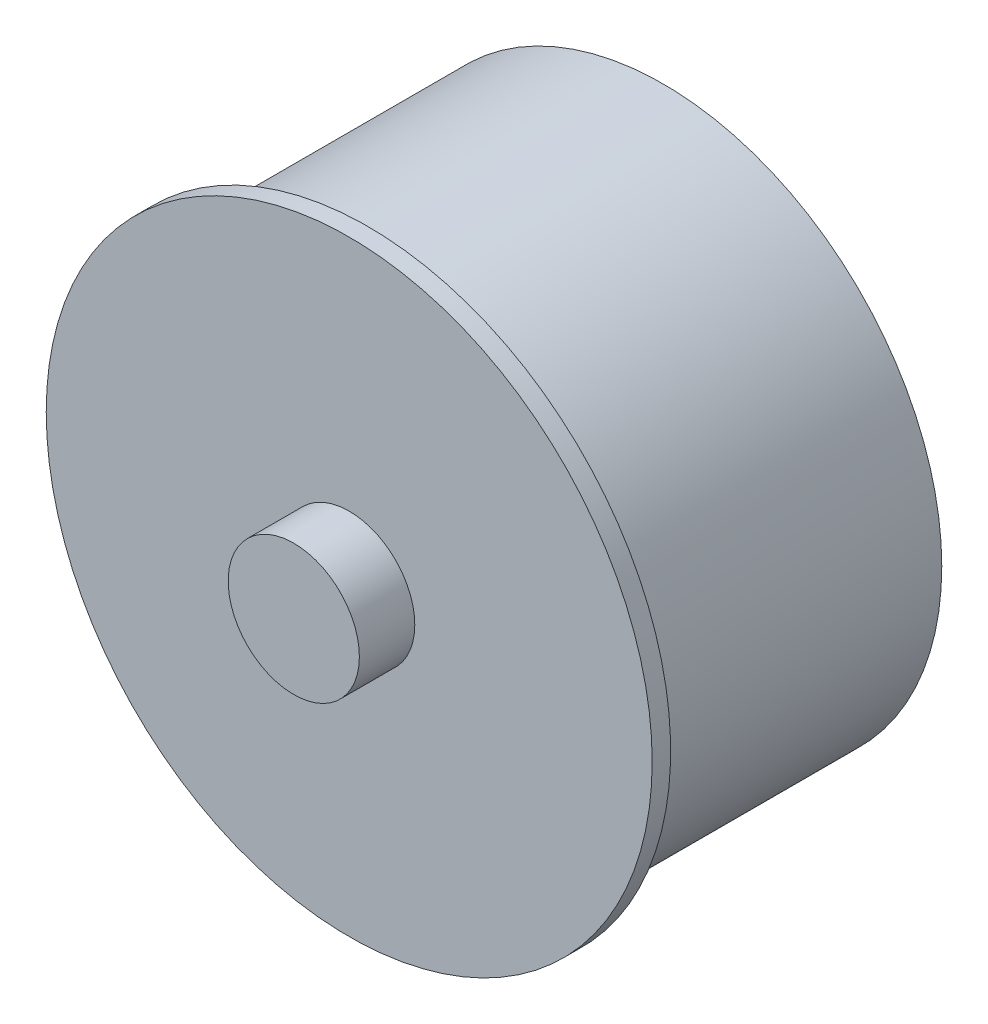
ISO-10303-21;
HEADER;
FILE_DESCRIPTION(('STEP AP214'),'2;1');
FILE_NAME('part.step','',(''),(''),'','','');
FILE_SCHEMA(('AUTOMOTIVE_DESIGN { 1 0 10303 214 1 1 1 1 }'));
ENDSEC;
DATA;
#1=APPLICATION_CONTEXT('core data for automotive mechanical design processes');
#2=APPLICATION_PROTOCOL_DEFINITION('international standard','automotive_design',2000,#1);
#3=PRODUCT_CONTEXT('',#1,'mechanical');
#4=PRODUCT('Part','Part','',(#3));
#5=PRODUCT_RELATED_PRODUCT_CATEGORY('part','',(#4));
#6=PRODUCT_DEFINITION_FORMATION('','',#4);
#7=PRODUCT_DEFINITION_CONTEXT('part definition',#1,'design');
#8=PRODUCT_DEFINITION('design','',#6,#7);
#9=PRODUCT_DEFINITION_SHAPE('','',#8);
#10=(LENGTH_UNIT() NAMED_UNIT(*) SI_UNIT(.MILLI.,.METRE.));
#11=(NAMED_UNIT(*) PLANE_ANGLE_UNIT() SI_UNIT($,.RADIAN.));
#12=(NAMED_UNIT(*) SI_UNIT($,.STERADIAN.) SOLID_ANGLE_UNIT());
#13=UNCERTAINTY_MEASURE_WITH_UNIT(LENGTH_MEASURE(1.E-05),#10,'distance_accuracy_value','');
#14=(GEOMETRIC_REPRESENTATION_CONTEXT(3) GLOBAL_UNCERTAINTY_ASSIGNED_CONTEXT((#13)) GLOBAL_UNIT_ASSIGNED_CONTEXT((#10,
#11,#12)) REPRESENTATION_CONTEXT('',''));
#15=CARTESIAN_POINT('',(0.,0.,0.));
#16=DIRECTION('',(0.,0.,1.));
#17=DIRECTION('',(1.,0.,0.));
#18=AXIS2_PLACEMENT_3D('',#15,#16,#17);
#19=CARTESIAN_POINT('',(0.,0.,-2.));
#20=DIRECTION('',(0.,0.,1.));
#21=DIRECTION('',(1.,0.,0.));
#22=AXIS2_PLACEMENT_3D('',#19,#20,#21);
#23=CYLINDRICAL_SURFACE('',#22,10.075);
#24=CARTESIAN_POINT('',(0.,0.,-2.));
#25=DIRECTION('',(0.,0.,-1.));
#26=DIRECTION('',(-1.,0.,0.));
#27=AXIS2_PLACEMENT_3D('',#24,#25,#26);
#28=CIRCLE('',#27,10.075);
#29=CARTESIAN_POINT('',(-10.075,0.,-2.));
#30=VERTEX_POINT('',#29);
#31=EDGE_CURVE('E11',#30,#30,#28,.T.);
#32=ORIENTED_EDGE('',*,*,#31,.F.);
#33=EDGE_LOOP('',(#32));
#34=FACE_BOUND('',#33,.T.);
#35=CARTESIAN_POINT('',(0.,0.,0.));
#36=DIRECTION('',(0.,0.,-1.));
#37=DIRECTION('',(-1.,0.,0.));
#38=AXIS2_PLACEMENT_3D('',#35,#36,#37);
#39=CIRCLE('',#38,10.075);
#40=CARTESIAN_POINT('',(-10.075,0.,0.));
#41=VERTEX_POINT('',#40);
#42=EDGE_CURVE('E52',#41,#41,#39,.T.);
#43=ORIENTED_EDGE('',*,*,#42,.T.);
#44=EDGE_LOOP('',(#43));
#45=FACE_BOUND('',#44,.T.);
#46=ADVANCED_FACE('F45',(#34,#45),#23,.T.);
#47=CARTESIAN_POINT('',(0.,0.,-2.));
#48=DIRECTION('',(0.,0.,-1.));
#49=DIRECTION('',(-1.,0.,0.));
#50=AXIS2_PLACEMENT_3D('',#47,#48,#49);
#51=PLANE('',#50);
#52=CARTESIAN_POINT('',(0.,8.,-2.));
#53=DIRECTION('',(0.,0.,-1.));
#54=DIRECTION('',(-1.,0.,0.));
#55=AXIS2_PLACEMENT_3D('',#52,#53,#54);
#56=CIRCLE('',#55,1.05);
#57=CARTESIAN_POINT('',(-1.05,8.,-2.));
#58=VERTEX_POINT('',#57);
#59=EDGE_CURVE('E66',#58,#58,#56,.T.);
#60=ORIENTED_EDGE('',*,*,#59,.F.);
#61=EDGE_LOOP('',(#60));
#62=FACE_BOUND('',#61,.T.);
#63=CARTESIAN_POINT('',(-8.,0.,-2.));
#64=DIRECTION('',(0.,0.,-1.));
#65=DIRECTION('',(-1.,0.,0.));
#66=AXIS2_PLACEMENT_3D('',#63,#64,#65);
#67=CIRCLE('',#66,1.05);
#68=CARTESIAN_POINT('',(-9.05,0.,-2.));
#69=VERTEX_POINT('',#68);
#70=EDGE_CURVE('E122',#69,#69,#67,.T.);
#71=ORIENTED_EDGE('',*,*,#70,.F.);
#72=EDGE_LOOP('',(#71));
#73=FACE_BOUND('',#72,.T.);
#74=CARTESIAN_POINT('',(0.,-8.,-2.));
#75=DIRECTION('',(0.,0.,-1.));
#76=DIRECTION('',(-1.,0.,0.));
#77=AXIS2_PLACEMENT_3D('',#74,#75,#76);
#78=CIRCLE('',#77,1.05);
#79=CARTESIAN_POINT('',(-1.04999999999994,-8.,-2.));
#80=VERTEX_POINT('',#79);
#81=EDGE_CURVE('E115',#80,#80,#78,.T.);
#82=ORIENTED_EDGE('',*,*,#81,.F.);
#83=EDGE_LOOP('',(#82));
#84=FACE_BOUND('',#83,.T.);
#85=CARTESIAN_POINT('',(8.,0.,-2.));
#86=DIRECTION('',(0.,0.,-1.));
#87=DIRECTION('',(-1.,0.,0.));
#88=AXIS2_PLACEMENT_3D('',#85,#86,#87);
#89=CIRCLE('',#88,1.05);
#90=CARTESIAN_POINT('',(6.95,0.,-2.));
#91=VERTEX_POINT('',#90);
#92=EDGE_CURVE('E59',#91,#91,#89,.T.);
#93=ORIENTED_EDGE('',*,*,#92,.F.);
#94=EDGE_LOOP('',(#93));
#95=FACE_BOUND('',#94,.T.);
#96=ORIENTED_EDGE('',*,*,#31,.T.);
#97=EDGE_LOOP('',(#96));
#98=FACE_BOUND('',#97,.T.);
#99=ADVANCED_FACE('F90',(#62,#73,#84,#95,#98),#51,.T.);
#100=CARTESIAN_POINT('',(0.,0.,0.));
#101=DIRECTION('',(0.,0.,-1.));
#102=DIRECTION('',(-1.,0.,0.));
#103=AXIS2_PLACEMENT_3D('',#100,#101,#102);
#104=PLANE('',#103);
#105=CARTESIAN_POINT('',(0.,8.,0.));
#106=DIRECTION('',(0.,0.,-1.));
#107=DIRECTION('',(-1.,0.,0.));
#108=AXIS2_PLACEMENT_3D('',#105,#106,#107);
#109=CIRCLE('',#108,1.05);
#110=CARTESIAN_POINT('',(-1.05,8.,0.));
#111=VERTEX_POINT('',#110);
#112=EDGE_CURVE('E48',#111,#111,#109,.T.);
#113=ORIENTED_EDGE('',*,*,#112,.T.);
#114=EDGE_LOOP('',(#113));
#115=FACE_BOUND('',#114,.T.);
#116=CARTESIAN_POINT('',(-8.,0.,0.));
#117=DIRECTION('',(0.,0.,-1.));
#118=DIRECTION('',(-1.,0.,0.));
#119=AXIS2_PLACEMENT_3D('',#116,#117,#118);
#120=CIRCLE('',#119,1.05);
#121=CARTESIAN_POINT('',(-9.05,0.,0.));
#122=VERTEX_POINT('',#121);
#123=EDGE_CURVE('E68',#122,#122,#120,.T.);
#124=ORIENTED_EDGE('',*,*,#123,.T.);
#125=EDGE_LOOP('',(#124));
#126=FACE_BOUND('',#125,.T.);
#127=CARTESIAN_POINT('',(0.,-8.,0.));
#128=DIRECTION('',(0.,0.,-1.));
#129=DIRECTION('',(-1.,0.,0.));
#130=AXIS2_PLACEMENT_3D('',#127,#128,#129);
#131=CIRCLE('',#130,1.05);
#132=CARTESIAN_POINT('',(-1.04999999999994,-8.,0.));
#133=VERTEX_POINT('',#132);
#134=EDGE_CURVE('E65',#133,#133,#131,.T.);
#135=ORIENTED_EDGE('',*,*,#134,.T.);
#136=EDGE_LOOP('',(#135));
#137=FACE_BOUND('',#136,.T.);
#138=CARTESIAN_POINT('',(8.,0.,0.));
#139=DIRECTION('',(0.,0.,-1.));
#140=DIRECTION('',(-1.,0.,0.));
#141=AXIS2_PLACEMENT_3D('',#138,#139,#140);
#142=CIRCLE('',#141,1.05);
#143=CARTESIAN_POINT('',(6.95,0.,0.));
#144=VERTEX_POINT('',#143);
#145=EDGE_CURVE('E62',#144,#144,#142,.T.);
#146=ORIENTED_EDGE('',*,*,#145,.T.);
#147=EDGE_LOOP('',(#146));
#148=FACE_BOUND('',#147,.T.);
#149=ORIENTED_EDGE('',*,*,#42,.F.);
#150=EDGE_LOOP('',(#149));
#151=FACE_BOUND('',#150,.T.);
#152=ADVANCED_FACE('F75',(#115,#126,#137,#148,#151),#104,.F.);
#153=CARTESIAN_POINT('',(8.,0.,8.));
#154=DIRECTION('',(0.,0.,-1.));
#155=DIRECTION('',(-1.,0.,0.));
#156=AXIS2_PLACEMENT_3D('',#153,#154,#155);
#157=CYLINDRICAL_SURFACE('',#156,1.05);
#158=ORIENTED_EDGE('',*,*,#92,.T.);
#159=EDGE_LOOP('',(#158));
#160=FACE_BOUND('',#159,.T.);
#161=ORIENTED_EDGE('',*,*,#145,.F.);
#162=EDGE_LOOP('',(#161));
#163=FACE_BOUND('',#162,.T.);
#164=ADVANCED_FACE('F101',(#160,#163),#157,.F.);
#165=CARTESIAN_POINT('',(0.,-8.,8.));
#166=DIRECTION('',(0.,0.,-1.));
#167=DIRECTION('',(-1.,0.,0.));
#168=AXIS2_PLACEMENT_3D('',#165,#166,#167);
#169=CYLINDRICAL_SURFACE('',#168,1.05);
#170=ORIENTED_EDGE('',*,*,#81,.T.);
#171=EDGE_LOOP('',(#170));
#172=FACE_BOUND('',#171,.T.);
#173=ORIENTED_EDGE('',*,*,#134,.F.);
#174=EDGE_LOOP('',(#173));
#175=FACE_BOUND('',#174,.T.);
#176=ADVANCED_FACE('F85',(#172,#175),#169,.F.);
#177=CARTESIAN_POINT('',(-8.,0.,8.));
#178=DIRECTION('',(0.,0.,-1.));
#179=DIRECTION('',(-1.,0.,0.));
#180=AXIS2_PLACEMENT_3D('',#177,#178,#179);
#181=CYLINDRICAL_SURFACE('',#180,1.05);
#182=ORIENTED_EDGE('',*,*,#70,.T.);
#183=EDGE_LOOP('',(#182));
#184=FACE_BOUND('',#183,.T.);
#185=ORIENTED_EDGE('',*,*,#123,.F.);
#186=EDGE_LOOP('',(#185));
#187=FACE_BOUND('',#186,.T.);
#188=ADVANCED_FACE('F79',(#184,#187),#181,.F.);
#189=CARTESIAN_POINT('',(0.,8.,8.));
#190=DIRECTION('',(0.,0.,-1.));
#191=DIRECTION('',(-1.,0.,0.));
#192=AXIS2_PLACEMENT_3D('',#189,#190,#191);
#193=CYLINDRICAL_SURFACE('',#192,1.05);
#194=ORIENTED_EDGE('',*,*,#59,.T.);
#195=EDGE_LOOP('',(#194));
#196=FACE_BOUND('',#195,.T.);
#197=ORIENTED_EDGE('',*,*,#112,.F.);
#198=EDGE_LOOP('',(#197));
#199=FACE_BOUND('',#198,.T.);
#200=ADVANCED_FACE('F77',(#196,#199),#193,.F.);
#201=CLOSED_SHELL('',(#46,#99,#152,#164,#176,#188,#200));
#202=MANIFOLD_SOLID_BREP('B2',#201);
#203=CARTESIAN_POINT('',(0.,0.,17.));
#204=DIRECTION('',(0.,0.,-1.));
#205=DIRECTION('',(-1.,0.,0.));
#206=AXIS2_PLACEMENT_3D('',#203,#204,#205);
#207=CYLINDRICAL_SURFACE('',#206,16.4);
#208=CARTESIAN_POINT('',(0.,0.,17.));
#209=DIRECTION('',(0.,0.,1.));
#210=DIRECTION('',(1.,0.,0.));
#211=AXIS2_PLACEMENT_3D('',#208,#209,#210);
#212=CIRCLE('',#211,16.4);
#213=CARTESIAN_POINT('',(16.4,0.,17.));
#214=VERTEX_POINT('',#213);
#215=EDGE_CURVE('E178',#214,#214,#212,.T.);
#216=ORIENTED_EDGE('',*,*,#215,.F.);
#217=EDGE_LOOP('',(#216));
#218=FACE_BOUND('',#217,.T.);
#219=CARTESIAN_POINT('',(0.,0.,16.));
#220=DIRECTION('',(0.,0.,-1.));
#221=DIRECTION('',(-1.,0.,0.));
#222=AXIS2_PLACEMENT_3D('',#219,#220,#221);
#223=CIRCLE('',#222,16.4);
#224=CARTESIAN_POINT('',(-16.4,0.,16.));
#225=VERTEX_POINT('',#224);
#226=EDGE_CURVE('E232',#225,#225,#223,.T.);
#227=ORIENTED_EDGE('',*,*,#226,.F.);
#228=EDGE_LOOP('',(#227));
#229=FACE_BOUND('',#228,.T.);
#230=ADVANCED_FACE('F170',(#218,#229),#207,.T.);
#231=CARTESIAN_POINT('',(0.,0.,17.));
#232=DIRECTION('',(0.,0.,1.));
#233=DIRECTION('',(1.,0.,0.));
#234=AXIS2_PLACEMENT_3D('',#231,#232,#233);
#235=PLANE('',#234);
#236=CARTESIAN_POINT('',(0.,0.,17.));
#237=DIRECTION('',(0.,0.,1.));
#238=DIRECTION('',(1.,0.,0.));
#239=AXIS2_PLACEMENT_3D('',#236,#237,#238);
#240=CIRCLE('',#239,3.55);
#241=CARTESIAN_POINT('',(3.55,0.,17.));
#242=VERTEX_POINT('',#241);
#243=EDGE_CURVE('E44',#242,#242,#240,.T.);
#244=ORIENTED_EDGE('',*,*,#243,.F.);
#245=EDGE_LOOP('',(#244));
#246=FACE_BOUND('',#245,.T.);
#247=ORIENTED_EDGE('',*,*,#215,.T.);
#248=EDGE_LOOP('',(#247));
#249=FACE_BOUND('',#248,.T.);
#250=ADVANCED_FACE('F214',(#246,#249),#235,.T.);
#251=CARTESIAN_POINT('',(0.,0.,20.));
#252=DIRECTION('',(0.,0.,-1.));
#253=DIRECTION('',(-1.,0.,0.));
#254=AXIS2_PLACEMENT_3D('',#251,#252,#253);
#255=CYLINDRICAL_SURFACE('',#254,3.55);
#256=CARTESIAN_POINT('',(0.,0.,20.));
#257=DIRECTION('',(0.,0.,1.));
#258=DIRECTION('',(1.,0.,0.));
#259=AXIS2_PLACEMENT_3D('',#256,#257,#258);
#260=CIRCLE('',#259,3.55);
#261=CARTESIAN_POINT('',(3.55,0.,20.));
#262=VERTEX_POINT('',#261);
#263=EDGE_CURVE('E184',#262,#262,#260,.T.);
#264=ORIENTED_EDGE('',*,*,#263,.F.);
#265=EDGE_LOOP('',(#264));
#266=FACE_BOUND('',#265,.T.);
#267=ORIENTED_EDGE('',*,*,#243,.T.);
#268=EDGE_LOOP('',(#267));
#269=FACE_BOUND('',#268,.T.);
#270=ADVANCED_FACE('F212',(#266,#269),#255,.T.);
#271=CARTESIAN_POINT('',(0.,0.,20.));
#272=DIRECTION('',(0.,0.,1.));
#273=DIRECTION('',(1.,0.,0.));
#274=AXIS2_PLACEMENT_3D('',#271,#272,#273);
#275=PLANE('',#274);
#276=ORIENTED_EDGE('',*,*,#263,.T.);
#277=EDGE_LOOP('',(#276));
#278=FACE_BOUND('',#277,.T.);
#279=ADVANCED_FACE('F210',(#278),#275,.T.);
#280=CARTESIAN_POINT('',(0.,0.,16.));
#281=DIRECTION('',(0.,0.,-1.));
#282=DIRECTION('',(-1.,0.,0.));
#283=AXIS2_PLACEMENT_3D('',#280,#281,#282);
#284=PLANE('',#283);
#285=CARTESIAN_POINT('',(0.,0.,16.));
#286=DIRECTION('',(0.,0.,-1.));
#287=DIRECTION('',(-1.,0.,0.));
#288=AXIS2_PLACEMENT_3D('',#285,#286,#287);
#289=CIRCLE('',#288,15.075);
#290=CARTESIAN_POINT('',(-15.075,0.,16.));
#291=VERTEX_POINT('',#290);
#292=EDGE_CURVE('E236',#291,#291,#289,.T.);
#293=ORIENTED_EDGE('',*,*,#292,.F.);
#294=EDGE_LOOP('',(#293));
#295=FACE_BOUND('',#294,.T.);
#296=ORIENTED_EDGE('',*,*,#226,.T.);
#297=EDGE_LOOP('',(#296));
#298=FACE_BOUND('',#297,.T.);
#299=ADVANCED_FACE('F220',(#295,#298),#284,.T.);
#300=CARTESIAN_POINT('',(0.,0.,16.));
#301=DIRECTION('',(0.,0.,-1.));
#302=DIRECTION('',(-1.,0.,0.));
#303=AXIS2_PLACEMENT_3D('',#300,#301,#302);
#304=CYLINDRICAL_SURFACE('',#303,15.075);
#305=ORIENTED_EDGE('',*,*,#292,.T.);
#306=EDGE_LOOP('',(#305));
#307=FACE_BOUND('',#306,.T.);
#308=CARTESIAN_POINT('',(0.,0.,0.));
#309=DIRECTION('',(0.,0.,-1.));
#310=DIRECTION('',(-1.,0.,0.));
#311=AXIS2_PLACEMENT_3D('',#308,#309,#310);
#312=CIRCLE('',#311,15.075);
#313=CARTESIAN_POINT('',(-15.075,0.,0.));
#314=VERTEX_POINT('',#313);
#315=EDGE_CURVE('E243',#314,#314,#312,.T.);
#316=ORIENTED_EDGE('',*,*,#315,.F.);
#317=EDGE_LOOP('',(#316));
#318=FACE_BOUND('',#317,.T.);
#319=ADVANCED_FACE('F276',(#307,#318),#304,.T.);
#320=CARTESIAN_POINT('',(0.,0.,8.));
#321=DIRECTION('',(0.,0.,-1.));
#322=DIRECTION('',(-1.,0.,0.));
#323=AXIS2_PLACEMENT_3D('',#320,#321,#322);
#324=PLANE('',#323);
#325=CARTESIAN_POINT('',(0.,8.,8.));
#326=DIRECTION('',(0.,0.,-1.));
#327=DIRECTION('',(-1.,0.,0.));
#328=AXIS2_PLACEMENT_3D('',#325,#326,#327);
#329=CIRCLE('',#328,1.05);
#330=CARTESIAN_POINT('',(-1.05,8.,8.));
#331=VERTEX_POINT('',#330);
#332=EDGE_CURVE('E194',#331,#331,#329,.T.);
#333=ORIENTED_EDGE('',*,*,#332,.T.);
#334=EDGE_LOOP('',(#333));
#335=FACE_BOUND('',#334,.T.);
#336=ADVANCED_FACE('F278',(#335),#324,.T.);
#337=CARTESIAN_POINT('',(0.,0.,8.));
#338=DIRECTION('',(0.,0.,-1.));
#339=DIRECTION('',(-1.,0.,0.));
#340=AXIS2_PLACEMENT_3D('',#337,#338,#339);
#341=PLANE('',#340);
#342=CARTESIAN_POINT('',(-8.,0.,8.));
#343=DIRECTION('',(0.,0.,-1.));
#344=DIRECTION('',(-1.,0.,0.));
#345=AXIS2_PLACEMENT_3D('',#342,#343,#344);
#346=CIRCLE('',#345,1.05);
#347=CARTESIAN_POINT('',(-9.05,0.,8.));
#348=VERTEX_POINT('',#347);
#349=EDGE_CURVE('E250',#348,#348,#346,.T.);
#350=ORIENTED_EDGE('',*,*,#349,.T.);
#351=EDGE_LOOP('',(#350));
#352=FACE_BOUND('',#351,.T.);
#353=ADVANCED_FACE('F285',(#352),#341,.T.);
#354=CARTESIAN_POINT('',(0.,0.,8.));
#355=DIRECTION('',(0.,0.,-1.));
#356=DIRECTION('',(-1.,0.,0.));
#357=AXIS2_PLACEMENT_3D('',#354,#355,#356);
#358=PLANE('',#357);
#359=CARTESIAN_POINT('',(0.,-8.,8.));
#360=DIRECTION('',(0.,0.,-1.));
#361=DIRECTION('',(-1.,0.,0.));
#362=AXIS2_PLACEMENT_3D('',#359,#360,#361);
#363=CIRCLE('',#362,1.05);
#364=CARTESIAN_POINT('',(-1.04999999999994,-8.,8.));
#365=VERTEX_POINT('',#364);
#366=EDGE_CURVE('E241',#365,#365,#363,.T.);
#367=ORIENTED_EDGE('',*,*,#366,.T.);
#368=EDGE_LOOP('',(#367));
#369=FACE_BOUND('',#368,.T.);
#370=ADVANCED_FACE('F258',(#369),#358,.T.);
#371=CARTESIAN_POINT('',(0.,0.,8.));
#372=DIRECTION('',(0.,0.,-1.));
#373=DIRECTION('',(-1.,0.,0.));
#374=AXIS2_PLACEMENT_3D('',#371,#372,#373);
#375=PLANE('',#374);
#376=CARTESIAN_POINT('',(8.,0.,8.));
#377=DIRECTION('',(0.,0.,-1.));
#378=DIRECTION('',(-1.,0.,0.));
#379=AXIS2_PLACEMENT_3D('',#376,#377,#378);
#380=CIRCLE('',#379,1.05);
#381=CARTESIAN_POINT('',(6.95,0.,8.));
#382=VERTEX_POINT('',#381);
#383=EDGE_CURVE('E235',#382,#382,#380,.T.);
#384=ORIENTED_EDGE('',*,*,#383,.T.);
#385=EDGE_LOOP('',(#384));
#386=FACE_BOUND('',#385,.T.);
#387=ADVANCED_FACE('F294',(#386),#375,.T.);
#388=CARTESIAN_POINT('',(0.,8.,8.));
#389=DIRECTION('',(0.,0.,-1.));
#390=DIRECTION('',(-1.,0.,0.));
#391=AXIS2_PLACEMENT_3D('',#388,#389,#390);
#392=CYLINDRICAL_SURFACE('',#391,1.05);
#393=ORIENTED_EDGE('',*,*,#332,.F.);
#394=EDGE_LOOP('',(#393));
#395=FACE_BOUND('',#394,.T.);
#396=CARTESIAN_POINT('',(0.,8.,0.));
#397=DIRECTION('',(0.,0.,1.));
#398=DIRECTION('',(1.,0.,0.));
#399=AXIS2_PLACEMENT_3D('',#396,#397,#398);
#400=CIRCLE('',#399,1.05);
#401=CARTESIAN_POINT('',(1.05,8.,0.));
#402=VERTEX_POINT('',#401);
#403=EDGE_CURVE('E173',#402,#402,#400,.T.);
#404=ORIENTED_EDGE('',*,*,#403,.F.);
#405=EDGE_LOOP('',(#404));
#406=FACE_BOUND('',#405,.T.);
#407=ADVANCED_FACE('F291',(#395,#406),#392,.F.);
#408=CARTESIAN_POINT('',(-8.,0.,8.));
#409=DIRECTION('',(0.,0.,-1.));
#410=DIRECTION('',(-1.,0.,0.));
#411=AXIS2_PLACEMENT_3D('',#408,#409,#410);
#412=CYLINDRICAL_SURFACE('',#411,1.05);
#413=ORIENTED_EDGE('',*,*,#349,.F.);
#414=EDGE_LOOP('',(#413));
#415=FACE_BOUND('',#414,.T.);
#416=CARTESIAN_POINT('',(-8.,0.,0.));
#417=DIRECTION('',(0.,0.,1.));
#418=DIRECTION('',(1.,0.,0.));
#419=AXIS2_PLACEMENT_3D('',#416,#417,#418);
#420=CIRCLE('',#419,1.05);
#421=CARTESIAN_POINT('',(-6.95,0.,0.));
#422=VERTEX_POINT('',#421);
#423=EDGE_CURVE('E197',#422,#422,#420,.T.);
#424=ORIENTED_EDGE('',*,*,#423,.F.);
#425=EDGE_LOOP('',(#424));
#426=FACE_BOUND('',#425,.T.);
#427=ADVANCED_FACE('F264',(#415,#426),#412,.F.);
#428=CARTESIAN_POINT('',(0.,-8.,8.));
#429=DIRECTION('',(0.,0.,-1.));
#430=DIRECTION('',(-1.,0.,0.));
#431=AXIS2_PLACEMENT_3D('',#428,#429,#430);
#432=CYLINDRICAL_SURFACE('',#431,1.05);
#433=ORIENTED_EDGE('',*,*,#366,.F.);
#434=EDGE_LOOP('',(#433));
#435=FACE_BOUND('',#434,.T.);
#436=CARTESIAN_POINT('',(0.,-8.,0.));
#437=DIRECTION('',(0.,0.,1.));
#438=DIRECTION('',(1.,0.,0.));
#439=AXIS2_PLACEMENT_3D('',#436,#437,#438);
#440=CIRCLE('',#439,1.05);
#441=CARTESIAN_POINT('',(1.05000000000006,-8.,0.));
#442=VERTEX_POINT('',#441);
#443=EDGE_CURVE('E193',#442,#442,#440,.T.);
#444=ORIENTED_EDGE('',*,*,#443,.F.);
#445=EDGE_LOOP('',(#444));
#446=FACE_BOUND('',#445,.T.);
#447=ADVANCED_FACE('F260',(#435,#446),#432,.F.);
#448=CARTESIAN_POINT('',(8.,0.,8.));
#449=DIRECTION('',(0.,0.,-1.));
#450=DIRECTION('',(-1.,0.,0.));
#451=AXIS2_PLACEMENT_3D('',#448,#449,#450);
#452=CYLINDRICAL_SURFACE('',#451,1.05);
#453=ORIENTED_EDGE('',*,*,#383,.F.);
#454=EDGE_LOOP('',(#453));
#455=FACE_BOUND('',#454,.T.);
#456=CARTESIAN_POINT('',(8.,0.,0.));
#457=DIRECTION('',(0.,0.,1.));
#458=DIRECTION('',(1.,0.,0.));
#459=AXIS2_PLACEMENT_3D('',#456,#457,#458);
#460=CIRCLE('',#459,1.05);
#461=CARTESIAN_POINT('',(9.05,0.,0.));
#462=VERTEX_POINT('',#461);
#463=EDGE_CURVE('E189',#462,#462,#460,.T.);
#464=ORIENTED_EDGE('',*,*,#463,.F.);
#465=EDGE_LOOP('',(#464));
#466=FACE_BOUND('',#465,.T.);
#467=ADVANCED_FACE('F263',(#455,#466),#452,.F.);
#468=CARTESIAN_POINT('',(0.,0.,0.));
#469=DIRECTION('',(0.,0.,1.));
#470=DIRECTION('',(1.,0.,0.));
#471=AXIS2_PLACEMENT_3D('',#468,#469,#470);
#472=PLANE('',#471);
#473=ORIENTED_EDGE('',*,*,#463,.T.);
#474=EDGE_LOOP('',(#473));
#475=FACE_BOUND('',#474,.T.);
#476=ORIENTED_EDGE('',*,*,#443,.T.);
#477=EDGE_LOOP('',(#476));
#478=FACE_BOUND('',#477,.T.);
#479=ORIENTED_EDGE('',*,*,#423,.T.);
#480=EDGE_LOOP('',(#479));
#481=FACE_BOUND('',#480,.T.);
#482=ORIENTED_EDGE('',*,*,#403,.T.);
#483=EDGE_LOOP('',(#482));
#484=FACE_BOUND('',#483,.T.);
#485=ORIENTED_EDGE('',*,*,#315,.T.);
#486=EDGE_LOOP('',(#485));
#487=FACE_BOUND('',#486,.T.);
#488=ADVANCED_FACE('F268',(#475,#478,#481,#484,#487),#472,.F.);
#489=CLOSED_SHELL('',(#230,#250,#270,#279,#299,#319,#336,#353,#370,#387,#407,#427,#447,#467,#488));
#490=MANIFOLD_SOLID_BREP('B6',#489);
#491=ADVANCED_BREP_SHAPE_REPRESENTATION('',(#18,#202,#490),#14);
#492=SHAPE_DEFINITION_REPRESENTATION(#9,#491);
ENDSEC;
END-ISO-10303-21;
